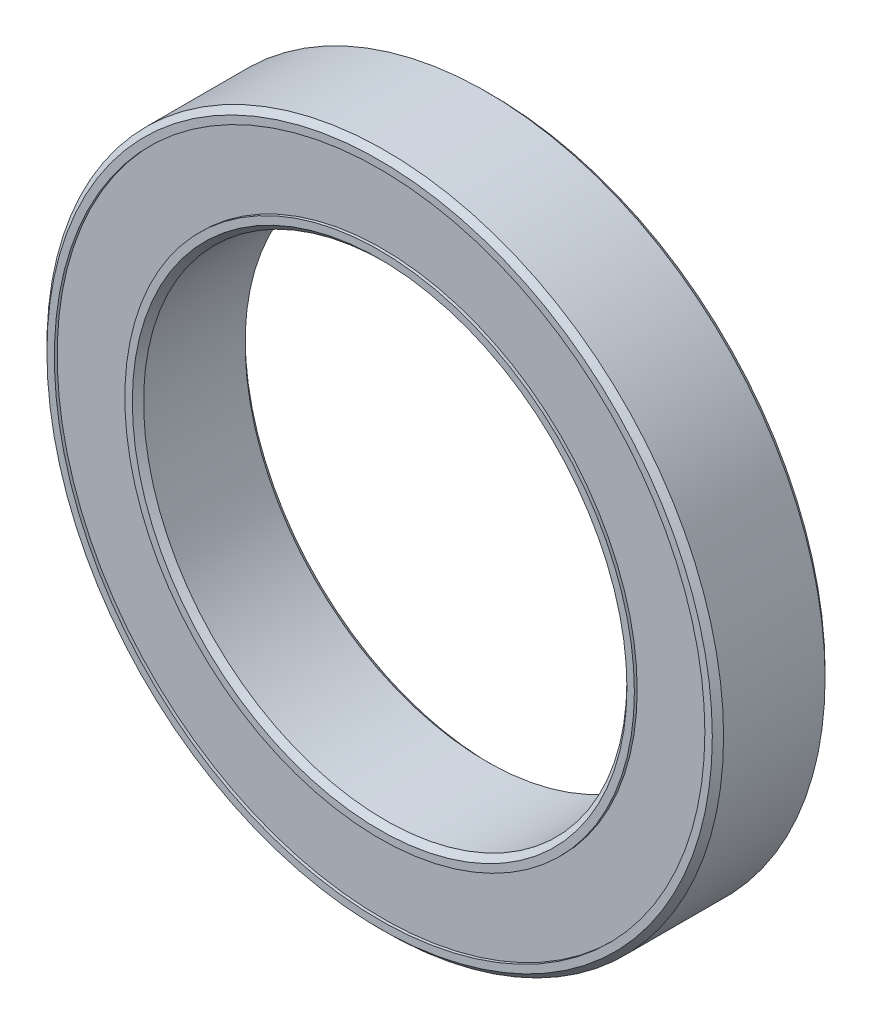
ISO-10303-21;
HEADER;
FILE_DESCRIPTION(('STEP AP214'),'2;1');
FILE_NAME('part.step','',(''),(''),'','','');
FILE_SCHEMA(('AUTOMOTIVE_DESIGN { 1 0 10303 214 1 1 1 1 }'));
ENDSEC;
DATA;
#1=APPLICATION_CONTEXT('core data for automotive mechanical design processes');
#2=APPLICATION_PROTOCOL_DEFINITION('international standard','automotive_design',2000,#1);
#3=PRODUCT_CONTEXT('',#1,'mechanical');
#4=PRODUCT('Part','Part','',(#3));
#5=PRODUCT_RELATED_PRODUCT_CATEGORY('part','',(#4));
#6=PRODUCT_DEFINITION_FORMATION('','',#4);
#7=PRODUCT_DEFINITION_CONTEXT('part definition',#1,'design');
#8=PRODUCT_DEFINITION('design','',#6,#7);
#9=PRODUCT_DEFINITION_SHAPE('','',#8);
#10=(LENGTH_UNIT() NAMED_UNIT(*) SI_UNIT(.MILLI.,.METRE.));
#11=(NAMED_UNIT(*) PLANE_ANGLE_UNIT() SI_UNIT($,.RADIAN.));
#12=(NAMED_UNIT(*) SI_UNIT($,.STERADIAN.) SOLID_ANGLE_UNIT());
#13=UNCERTAINTY_MEASURE_WITH_UNIT(LENGTH_MEASURE(1.E-05),#10,'distance_accuracy_value','');
#14=(GEOMETRIC_REPRESENTATION_CONTEXT(3) GLOBAL_UNCERTAINTY_ASSIGNED_CONTEXT((#13)) GLOBAL_UNIT_ASSIGNED_CONTEXT((#10,
#11,#12)) REPRESENTATION_CONTEXT('',''));
#15=CARTESIAN_POINT('',(0.,0.,0.));
#16=DIRECTION('',(0.,0.,1.));
#17=DIRECTION('',(1.,0.,0.));
#18=AXIS2_PLACEMENT_3D('',#15,#16,#17);
#19=CARTESIAN_POINT('',(0.,20.18725,-3.325));
#20=DIRECTION('',(0.,0.,1.));
#21=DIRECTION('',(1.,0.,0.));
#22=AXIS2_PLACEMENT_3D('',#19,#20,#21);
#23=PLANE('',#22);
#24=CARTESIAN_POINT('',(0.,0.,-3.325));
#25=DIRECTION('',(0.,0.,1.));
#26=DIRECTION('',(1.,0.,0.));
#27=AXIS2_PLACEMENT_3D('',#24,#25,#26);
#28=CIRCLE('',#27,20.18725);
#29=CARTESIAN_POINT('',(20.18725,0.,-3.325));
#30=VERTEX_POINT('',#29);
#31=EDGE_CURVE('E60',#30,#30,#28,.T.);
#32=ORIENTED_EDGE('',*,*,#31,.F.);
#33=EDGE_LOOP('',(#32));
#34=FACE_BOUND('',#33,.T.);
#35=CARTESIAN_POINT('',(0.,0.,-3.325));
#36=DIRECTION('',(0.,0.,1.));
#37=DIRECTION('',(1.,0.,0.));
#38=AXIS2_PLACEMENT_3D('',#35,#36,#37);
#39=CIRCLE('',#38,15.81225);
#40=CARTESIAN_POINT('',(15.81225,0.,-3.325));
#41=VERTEX_POINT('',#40);
#42=EDGE_CURVE('E11',#41,#41,#39,.T.);
#43=ORIENTED_EDGE('',*,*,#42,.T.);
#44=EDGE_LOOP('',(#43));
#45=FACE_BOUND('',#44,.T.);
#46=ADVANCED_FACE('F46',(#34,#45),#23,.F.);
#47=CARTESIAN_POINT('',(0.,0.,3.5));
#48=DIRECTION('',(0.,0.,1.));
#49=DIRECTION('',(1.,0.,0.));
#50=AXIS2_PLACEMENT_3D('',#47,#48,#49);
#51=CYLINDRICAL_SURFACE('',#50,15.81225);
#52=ORIENTED_EDGE('',*,*,#42,.F.);
#53=EDGE_LOOP('',(#52));
#54=FACE_BOUND('',#53,.T.);
#55=CARTESIAN_POINT('',(0.,0.,-2.68419621794304));
#56=DIRECTION('',(0.,0.,1.));
#57=DIRECTION('',(1.,0.,0.));
#58=AXIS2_PLACEMENT_3D('',#55,#56,#57);
#59=CIRCLE('',#58,15.81225);
#60=CARTESIAN_POINT('',(15.81225,0.,-2.68419621794304));
#61=VERTEX_POINT('',#60);
#62=EDGE_CURVE('E52',#61,#61,#59,.T.);
#63=ORIENTED_EDGE('',*,*,#62,.T.);
#64=EDGE_LOOP('',(#63));
#65=FACE_BOUND('',#64,.T.);
#66=ADVANCED_FACE('F69',(#54,#65),#51,.F.);
#67=CARTESIAN_POINT('',(0.,20.18725,-2.68419621794304));
#68=DIRECTION('',(0.,0.,-1.));
#69=DIRECTION('',(-1.,0.,0.));
#70=AXIS2_PLACEMENT_3D('',#67,#68,#69);
#71=PLANE('',#70);
#72=ORIENTED_EDGE('',*,*,#62,.F.);
#73=EDGE_LOOP('',(#72));
#74=FACE_BOUND('',#73,.T.);
#75=CARTESIAN_POINT('',(0.,0.,-2.68419621794304));
#76=DIRECTION('',(0.,0.,1.));
#77=DIRECTION('',(1.,0.,0.));
#78=AXIS2_PLACEMENT_3D('',#75,#76,#77);
#79=CIRCLE('',#78,20.18725);
#80=CARTESIAN_POINT('',(20.18725,0.,-2.68419621794304));
#81=VERTEX_POINT('',#80);
#82=EDGE_CURVE('E56',#81,#81,#79,.T.);
#83=ORIENTED_EDGE('',*,*,#82,.T.);
#84=EDGE_LOOP('',(#83));
#85=FACE_BOUND('',#84,.T.);
#86=ADVANCED_FACE('F73',(#74,#85),#71,.F.);
#87=CARTESIAN_POINT('',(0.,0.,3.5));
#88=DIRECTION('',(0.,0.,1.));
#89=DIRECTION('',(1.,0.,0.));
#90=AXIS2_PLACEMENT_3D('',#87,#88,#89);
#91=CYLINDRICAL_SURFACE('',#90,20.18725);
#92=ORIENTED_EDGE('',*,*,#82,.F.);
#93=EDGE_LOOP('',(#92));
#94=FACE_BOUND('',#93,.T.);
#95=ORIENTED_EDGE('',*,*,#31,.T.);
#96=EDGE_LOOP('',(#95));
#97=FACE_BOUND('',#96,.T.);
#98=ADVANCED_FACE('F66',(#94,#97),#91,.T.);
#99=CLOSED_SHELL('',(#46,#66,#86,#98));
#100=MANIFOLD_SOLID_BREP('B2',#99);
#101=CARTESIAN_POINT('',(0.,20.18725,3.325));
#102=DIRECTION('',(0.,0.,-1.));
#103=DIRECTION('',(-1.,0.,0.));
#104=AXIS2_PLACEMENT_3D('',#101,#102,#103);
#105=PLANE('',#104);
#106=CARTESIAN_POINT('',(0.,0.,3.325));
#107=DIRECTION('',(0.,0.,1.));
#108=DIRECTION('',(1.,0.,0.));
#109=AXIS2_PLACEMENT_3D('',#106,#107,#108);
#110=CIRCLE('',#109,15.81225);
#111=CARTESIAN_POINT('',(15.81225,0.,3.325));
#112=VERTEX_POINT('',#111);
#113=EDGE_CURVE('E45',#112,#112,#110,.T.);
#114=ORIENTED_EDGE('',*,*,#113,.F.);
#115=EDGE_LOOP('',(#114));
#116=FACE_BOUND('',#115,.T.);
#117=CARTESIAN_POINT('',(0.,0.,3.325));
#118=DIRECTION('',(0.,0.,1.));
#119=DIRECTION('',(1.,0.,0.));
#120=AXIS2_PLACEMENT_3D('',#117,#118,#119);
#121=CIRCLE('',#120,20.18725);
#122=CARTESIAN_POINT('',(20.18725,0.,3.325));
#123=VERTEX_POINT('',#122);
#124=EDGE_CURVE('E120',#123,#123,#121,.T.);
#125=ORIENTED_EDGE('',*,*,#124,.T.);
#126=EDGE_LOOP('',(#125));
#127=FACE_BOUND('',#126,.T.);
#128=ADVANCED_FACE('F106',(#116,#127),#105,.F.);
#129=CARTESIAN_POINT('',(0.,0.,3.5));
#130=DIRECTION('',(0.,0.,1.));
#131=DIRECTION('',(1.,0.,0.));
#132=AXIS2_PLACEMENT_3D('',#129,#130,#131);
#133=CYLINDRICAL_SURFACE('',#132,15.81225);
#134=CARTESIAN_POINT('',(0.,0.,2.68419621794304));
#135=DIRECTION('',(0.,0.,1.));
#136=DIRECTION('',(1.,0.,0.));
#137=AXIS2_PLACEMENT_3D('',#134,#135,#136);
#138=CIRCLE('',#137,15.81225);
#139=CARTESIAN_POINT('',(15.81225,0.,2.68419621794304));
#140=VERTEX_POINT('',#139);
#141=EDGE_CURVE('E112',#140,#140,#138,.T.);
#142=ORIENTED_EDGE('',*,*,#141,.F.);
#143=EDGE_LOOP('',(#142));
#144=FACE_BOUND('',#143,.T.);
#145=ORIENTED_EDGE('',*,*,#113,.T.);
#146=EDGE_LOOP('',(#145));
#147=FACE_BOUND('',#146,.T.);
#148=ADVANCED_FACE('F135',(#144,#147),#133,.F.);
#149=CARTESIAN_POINT('',(0.,20.18725,2.68419621794304));
#150=DIRECTION('',(0.,0.,1.));
#151=DIRECTION('',(1.,0.,0.));
#152=AXIS2_PLACEMENT_3D('',#149,#150,#151);
#153=PLANE('',#152);
#154=CARTESIAN_POINT('',(0.,0.,2.68419621794304));
#155=DIRECTION('',(0.,0.,1.));
#156=DIRECTION('',(1.,0.,0.));
#157=AXIS2_PLACEMENT_3D('',#154,#155,#156);
#158=CIRCLE('',#157,20.18725);
#159=CARTESIAN_POINT('',(20.18725,0.,2.68419621794304));
#160=VERTEX_POINT('',#159);
#161=EDGE_CURVE('E116',#160,#160,#158,.T.);
#162=ORIENTED_EDGE('',*,*,#161,.F.);
#163=EDGE_LOOP('',(#162));
#164=FACE_BOUND('',#163,.T.);
#165=ORIENTED_EDGE('',*,*,#141,.T.);
#166=EDGE_LOOP('',(#165));
#167=FACE_BOUND('',#166,.T.);
#168=ADVANCED_FACE('F130',(#164,#167),#153,.F.);
#169=CARTESIAN_POINT('',(0.,0.,3.5));
#170=DIRECTION('',(0.,0.,1.));
#171=DIRECTION('',(1.,0.,0.));
#172=AXIS2_PLACEMENT_3D('',#169,#170,#171);
#173=CYLINDRICAL_SURFACE('',#172,20.18725);
#174=ORIENTED_EDGE('',*,*,#124,.F.);
#175=EDGE_LOOP('',(#174));
#176=FACE_BOUND('',#175,.T.);
#177=ORIENTED_EDGE('',*,*,#161,.T.);
#178=EDGE_LOOP('',(#177));
#179=FACE_BOUND('',#178,.T.);
#180=ADVANCED_FACE('F127',(#176,#179),#173,.T.);
#181=CLOSED_SHELL('',(#128,#148,#168,#180));
#182=MANIFOLD_SOLID_BREP('B6',#181);
#183=CARTESIAN_POINT('',(-8.9998749999998,15.5882407617691,0.));
#184=DIRECTION('',(0.,0.,1.));
#185=DIRECTION('',(-0.499999999999989,0.866025403784445,0.));
#186=AXIS2_PLACEMENT_3D('',#183,#184,#185);
#187=SPHERICAL_SURFACE('',#186,2.68419621794304);
#188=CARTESIAN_POINT('',(-8.9998749999998,15.5882407617691,2.68419621794304));
#189=VERTEX_POINT('',#188);
#190=VERTEX_LOOP('',#189);
#191=FACE_BOUND('',#190,.T.);
#192=ADVANCED_FACE('F166',(#191),#187,.T.);
#193=CLOSED_SHELL('',(#192));
#194=MANIFOLD_SOLID_BREP('B40',#193);
#195=CARTESIAN_POINT('',(-15.5882407617688,8.99987500000018,0.));
#196=DIRECTION('',(0.,0.,1.));
#197=DIRECTION('',(-0.866025403784433,0.50000000000001,0.));
#198=AXIS2_PLACEMENT_3D('',#195,#196,#197);
#199=SPHERICAL_SURFACE('',#198,2.68419621794304);
#200=CARTESIAN_POINT('',(-15.5882407617688,8.99987500000018,2.68419621794304));
#201=VERTEX_POINT('',#200);
#202=VERTEX_LOOP('',#201);
#203=FACE_BOUND('',#202,.T.);
#204=ADVANCED_FACE('F185',(#203),#199,.T.);
#205=CLOSED_SHELL('',(#204));
#206=MANIFOLD_SOLID_BREP('B102',#205);
#207=CARTESIAN_POINT('',(-17.99975,1.88537373686525E-13,0.));
#208=DIRECTION('',(0.,0.,1.));
#209=DIRECTION('',(-1.,0.,0.));
#210=AXIS2_PLACEMENT_3D('',#207,#208,#209);
#211=SPHERICAL_SURFACE('',#210,2.68419621794304);
#212=CARTESIAN_POINT('',(-17.99975,1.88537373686525E-13,2.68419621794304));
#213=VERTEX_POINT('',#212);
#214=VERTEX_LOOP('',#213);
#215=FACE_BOUND('',#214,.T.);
#216=ADVANCED_FACE('F204',(#215),#211,.T.);
#217=CLOSED_SHELL('',(#216));
#218=MANIFOLD_SOLID_BREP('B162',#217);
#219=CARTESIAN_POINT('',(-15.588240761769,-8.99987499999986,0.));
#220=DIRECTION('',(0.,0.,1.));
#221=DIRECTION('',(-0.866025403784443,-0.499999999999992,0.));
#222=AXIS2_PLACEMENT_3D('',#219,#220,#221);
#223=SPHERICAL_SURFACE('',#222,2.68419621794304);
#224=CARTESIAN_POINT('',(-15.588240761769,-8.99987499999986,2.68419621794304));
#225=VERTEX_POINT('',#224);
#226=VERTEX_LOOP('',#225);
#227=FACE_BOUND('',#226,.T.);
#228=ADVANCED_FACE('F223',(#227),#223,.T.);
#229=CLOSED_SHELL('',(#228));
#230=MANIFOLD_SOLID_BREP('B181',#229);
#231=CARTESIAN_POINT('',(-8.99987500000013,-15.5882407617689,0.));
#232=DIRECTION('',(0.,0.,1.));
#233=DIRECTION('',(-0.500000000000007,-0.866025403784435,0.));
#234=AXIS2_PLACEMENT_3D('',#231,#232,#233);
#235=SPHERICAL_SURFACE('',#234,2.68419621794304);
#236=CARTESIAN_POINT('',(-8.99987500000013,-15.5882407617689,2.68419621794304));
#237=VERTEX_POINT('',#236);
#238=VERTEX_LOOP('',#237);
#239=FACE_BOUND('',#238,.T.);
#240=ADVANCED_FACE('F242',(#239),#235,.T.);
#241=CLOSED_SHELL('',(#240));
#242=MANIFOLD_SOLID_BREP('B200',#241);
#243=CARTESIAN_POINT('',(-1.25691582457683E-13,-17.99975,0.));
#244=DIRECTION('',(0.,0.,1.));
#245=DIRECTION('',(0.,-1.,0.));
#246=AXIS2_PLACEMENT_3D('',#243,#244,#245);
#247=SPHERICAL_SURFACE('',#246,2.68419621794304);
#248=CARTESIAN_POINT('',(-1.25691582457683E-13,-17.99975,2.68419621794304));
#249=VERTEX_POINT('',#248);
#250=VERTEX_LOOP('',#249);
#251=FACE_BOUND('',#250,.T.);
#252=ADVANCED_FACE('F261',(#251),#247,.T.);
#253=CLOSED_SHELL('',(#252));
#254=MANIFOLD_SOLID_BREP('B219',#253);
#255=CARTESIAN_POINT('',(8.99987499999991,-15.588240761769,0.));
#256=DIRECTION('',(0.,0.,1.));
#257=DIRECTION('',(0.499999999999995,-0.866025403784442,0.));
#258=AXIS2_PLACEMENT_3D('',#255,#256,#257);
#259=SPHERICAL_SURFACE('',#258,2.68419621794304);
#260=CARTESIAN_POINT('',(8.99987499999991,-15.588240761769,2.68419621794304));
#261=VERTEX_POINT('',#260);
#262=VERTEX_LOOP('',#261);
#263=FACE_BOUND('',#262,.T.);
#264=ADVANCED_FACE('F280',(#263),#259,.T.);
#265=CLOSED_SHELL('',(#264));
#266=MANIFOLD_SOLID_BREP('B238',#265);
#267=CARTESIAN_POINT('',(15.5882407617689,-8.99987500000008,0.));
#268=DIRECTION('',(0.,0.,1.));
#269=DIRECTION('',(0.866025403784436,-0.500000000000004,0.));
#270=AXIS2_PLACEMENT_3D('',#267,#268,#269);
#271=SPHERICAL_SURFACE('',#270,2.68419621794304);
#272=CARTESIAN_POINT('',(15.5882407617689,-8.99987500000008,2.68419621794304));
#273=VERTEX_POINT('',#272);
#274=VERTEX_LOOP('',#273);
#275=FACE_BOUND('',#274,.T.);
#276=ADVANCED_FACE('F299',(#275),#271,.T.);
#277=CLOSED_SHELL('',(#276));
#278=MANIFOLD_SOLID_BREP('B257',#277);
#279=CARTESIAN_POINT('',(17.99975,0.,0.));
#280=DIRECTION('',(0.,0.,1.));
#281=DIRECTION('',(1.,0.,0.));
#282=AXIS2_PLACEMENT_3D('',#279,#280,#281);
#283=SPHERICAL_SURFACE('',#282,2.68419621794304);
#284=CARTESIAN_POINT('',(17.99975,0.,2.68419621794304));
#285=VERTEX_POINT('',#284);
#286=VERTEX_LOOP('',#285);
#287=FACE_BOUND('',#286,.T.);
#288=ADVANCED_FACE('F318',(#287),#283,.T.);
#289=CLOSED_SHELL('',(#288));
#290=MANIFOLD_SOLID_BREP('B276',#289);
#291=CARTESIAN_POINT('',(15.588240761769,8.99987499999996,0.));
#292=DIRECTION('',(0.,0.,1.));
#293=DIRECTION('',(0.86602540378444,0.499999999999998,0.));
#294=AXIS2_PLACEMENT_3D('',#291,#292,#293);
#295=SPHERICAL_SURFACE('',#294,2.68419621794304);
#296=CARTESIAN_POINT('',(15.588240761769,8.99987499999996,2.68419621794304));
#297=VERTEX_POINT('',#296);
#298=VERTEX_LOOP('',#297);
#299=FACE_BOUND('',#298,.T.);
#300=ADVANCED_FACE('F337',(#299),#295,.T.);
#301=CLOSED_SHELL('',(#300));
#302=MANIFOLD_SOLID_BREP('B295',#301);
#303=CARTESIAN_POINT('',(8.99987500000002,15.5882407617689,0.));
#304=DIRECTION('',(0.,0.,1.));
#305=DIRECTION('',(0.500000000000001,0.866025403784438,0.));
#306=AXIS2_PLACEMENT_3D('',#303,#304,#305);
#307=SPHERICAL_SURFACE('',#306,2.68419621794304);
#308=CARTESIAN_POINT('',(8.99987500000002,15.5882407617689,2.68419621794304));
#309=VERTEX_POINT('',#308);
#310=VERTEX_LOOP('',#309);
#311=FACE_BOUND('',#310,.T.);
#312=ADVANCED_FACE('F356',(#311),#307,.T.);
#313=CLOSED_SHELL('',(#312));
#314=MANIFOLD_SOLID_BREP('B314',#313);
#315=CARTESIAN_POINT('',(0.,17.99975,0.));
#316=DIRECTION('',(0.,0.,1.));
#317=DIRECTION('',(0.,1.,0.));
#318=AXIS2_PLACEMENT_3D('',#315,#316,#317);
#319=SPHERICAL_SURFACE('',#318,2.68419621794304);
#320=CARTESIAN_POINT('',(0.,17.99975,2.68419621794304));
#321=VERTEX_POINT('',#320);
#322=VERTEX_LOOP('',#321);
#323=FACE_BOUND('',#322,.T.);
#324=ADVANCED_FACE('F377',(#323),#319,.T.);
#325=CLOSED_SHELL('',(#324));
#326=MANIFOLD_SOLID_BREP('B333',#325);
#327=CARTESIAN_POINT('',(0.,0.,3.5));
#328=DIRECTION('',(0.,0.,1.));
#329=DIRECTION('',(1.,0.,0.));
#330=AXIS2_PLACEMENT_3D('',#327,#328,#329);
#331=CONICAL_SURFACE('',#330,15.3495,0.78539816339745);
#332=CARTESIAN_POINT('',(0.,0.,3.15));
#333=DIRECTION('',(0.,0.,1.));
#334=DIRECTION('',(1.,0.,0.));
#335=AXIS2_PLACEMENT_3D('',#332,#333,#334);
#336=CIRCLE('',#335,14.9995);
#337=CARTESIAN_POINT('',(14.9995,0.,3.15));
#338=VERTEX_POINT('',#337);
#339=EDGE_CURVE('E376',#338,#338,#336,.T.);
#340=ORIENTED_EDGE('',*,*,#339,.F.);
#341=EDGE_LOOP('',(#340));
#342=FACE_BOUND('',#341,.T.);
#343=CARTESIAN_POINT('',(0.,0.,3.5));
#344=DIRECTION('',(0.,0.,1.));
#345=DIRECTION('',(1.,0.,0.));
#346=AXIS2_PLACEMENT_3D('',#343,#344,#345);
#347=CIRCLE('',#346,15.3495);
#348=CARTESIAN_POINT('',(15.3495,0.,3.5));
#349=VERTEX_POINT('',#348);
#350=EDGE_CURVE('E423',#349,#349,#347,.T.);
#351=ORIENTED_EDGE('',*,*,#350,.T.);
#352=EDGE_LOOP('',(#351));
#353=FACE_BOUND('',#352,.T.);
#354=ADVANCED_FACE('F395',(#342,#353),#331,.F.);
#355=CARTESIAN_POINT('',(0.,0.,3.5));
#356=DIRECTION('',(0.,0.,1.));
#357=DIRECTION('',(1.,0.,0.));
#358=AXIS2_PLACEMENT_3D('',#355,#356,#357);
#359=CYLINDRICAL_SURFACE('',#358,14.9995);
#360=CARTESIAN_POINT('',(0.,0.,-3.15));
#361=DIRECTION('',(0.,0.,1.));
#362=DIRECTION('',(1.,0.,0.));
#363=AXIS2_PLACEMENT_3D('',#360,#361,#362);
#364=CIRCLE('',#363,14.9995);
#365=CARTESIAN_POINT('',(14.9995,0.,-3.15));
#366=VERTEX_POINT('',#365);
#367=EDGE_CURVE('E401',#366,#366,#364,.T.);
#368=ORIENTED_EDGE('',*,*,#367,.F.);
#369=EDGE_LOOP('',(#368));
#370=FACE_BOUND('',#369,.T.);
#371=ORIENTED_EDGE('',*,*,#339,.T.);
#372=EDGE_LOOP('',(#371));
#373=FACE_BOUND('',#372,.T.);
#374=ADVANCED_FACE('F460',(#370,#373),#359,.F.);
#375=CARTESIAN_POINT('',(0.,0.,-3.15));
#376=DIRECTION('',(0.,0.,-1.));
#377=DIRECTION('',(-1.,0.,0.));
#378=AXIS2_PLACEMENT_3D('',#375,#376,#377);
#379=CONICAL_SURFACE('',#378,14.9995,0.785398163397451);
#380=CARTESIAN_POINT('',(0.,0.,-3.5));
#381=DIRECTION('',(0.,0.,1.));
#382=DIRECTION('',(1.,0.,0.));
#383=AXIS2_PLACEMENT_3D('',#380,#381,#382);
#384=CIRCLE('',#383,15.3495);
#385=CARTESIAN_POINT('',(15.3495,0.,-3.5));
#386=VERTEX_POINT('',#385);
#387=EDGE_CURVE('E405',#386,#386,#384,.T.);
#388=ORIENTED_EDGE('',*,*,#387,.F.);
#389=EDGE_LOOP('',(#388));
#390=FACE_BOUND('',#389,.T.);
#391=ORIENTED_EDGE('',*,*,#367,.T.);
#392=EDGE_LOOP('',(#391));
#393=FACE_BOUND('',#392,.T.);
#394=ADVANCED_FACE('F455',(#390,#393),#379,.F.);
#395=CARTESIAN_POINT('',(0.,15.3495,-3.5));
#396=DIRECTION('',(0.,0.,1.));
#397=DIRECTION('',(1.,0.,0.));
#398=AXIS2_PLACEMENT_3D('',#395,#396,#397);
#399=PLANE('',#398);
#400=CARTESIAN_POINT('',(0.,0.,-3.5));
#401=DIRECTION('',(0.,0.,1.));
#402=DIRECTION('',(1.,0.,0.));
#403=AXIS2_PLACEMENT_3D('',#400,#401,#402);
#404=CIRCLE('',#403,15.81225);
#405=CARTESIAN_POINT('',(15.81225,0.,-3.5));
#406=VERTEX_POINT('',#405);
#407=EDGE_CURVE('E409',#406,#406,#404,.T.);
#408=ORIENTED_EDGE('',*,*,#407,.F.);
#409=EDGE_LOOP('',(#408));
#410=FACE_BOUND('',#409,.T.);
#411=ORIENTED_EDGE('',*,*,#387,.T.);
#412=EDGE_LOOP('',(#411));
#413=FACE_BOUND('',#412,.T.);
#414=ADVANCED_FACE('F449',(#410,#413),#399,.F.);
#415=CARTESIAN_POINT('',(0.,0.,3.5));
#416=DIRECTION('',(0.,0.,1.));
#417=DIRECTION('',(1.,0.,0.));
#418=AXIS2_PLACEMENT_3D('',#415,#416,#417);
#419=CYLINDRICAL_SURFACE('',#418,15.81225);
#420=CARTESIAN_POINT('',(0.,0.,-1.55555555555555));
#421=DIRECTION('',(0.,0.,1.));
#422=DIRECTION('',(1.,0.,0.));
#423=AXIS2_PLACEMENT_3D('',#420,#421,#422);
#424=CIRCLE('',#423,15.81225);
#425=CARTESIAN_POINT('',(15.81225,0.,-1.55555555555555));
#426=VERTEX_POINT('',#425);
#427=EDGE_CURVE('E414',#426,#426,#424,.T.);
#428=ORIENTED_EDGE('',*,*,#427,.F.);
#429=EDGE_LOOP('',(#428));
#430=FACE_BOUND('',#429,.T.);
#431=ORIENTED_EDGE('',*,*,#407,.T.);
#432=EDGE_LOOP('',(#431));
#433=FACE_BOUND('',#432,.T.);
#434=ADVANCED_FACE('F443',(#430,#433),#419,.T.);
#435=CARTESIAN_POINT('',(0.,0.,0.));
#436=DIRECTION('',(0.,0.,1.));
#437=DIRECTION('',(1.,0.,0.));
#438=AXIS2_PLACEMENT_3D('',#435,#436,#437);
#439=TOROIDAL_SURFACE('',#438,17.99975,2.68419621794304);
#440=CARTESIAN_POINT('',(0.,0.,1.55555555555556));
#441=DIRECTION('',(0.,0.,1.));
#442=DIRECTION('',(1.,0.,0.));
#443=AXIS2_PLACEMENT_3D('',#440,#441,#442);
#444=CIRCLE('',#443,15.81225);
#445=CARTESIAN_POINT('',(15.81225,0.,1.55555555555556));
#446=VERTEX_POINT('',#445);
#447=EDGE_CURVE('E417',#446,#446,#444,.T.);
#448=ORIENTED_EDGE('',*,*,#447,.F.);
#449=EDGE_LOOP('',(#448));
#450=FACE_BOUND('',#449,.T.);
#451=ORIENTED_EDGE('',*,*,#427,.T.);
#452=EDGE_LOOP('',(#451));
#453=FACE_BOUND('',#452,.T.);
#454=ADVANCED_FACE('F437',(#450,#453),#439,.F.);
#455=CARTESIAN_POINT('',(0.,0.,3.5));
#456=DIRECTION('',(0.,0.,1.));
#457=DIRECTION('',(1.,0.,0.));
#458=AXIS2_PLACEMENT_3D('',#455,#456,#457);
#459=CYLINDRICAL_SURFACE('',#458,15.81225);
#460=CARTESIAN_POINT('',(0.,0.,3.5));
#461=DIRECTION('',(0.,0.,1.));
#462=DIRECTION('',(1.,0.,0.));
#463=AXIS2_PLACEMENT_3D('',#460,#461,#462);
#464=CIRCLE('',#463,15.81225);
#465=CARTESIAN_POINT('',(15.81225,0.,3.5));
#466=VERTEX_POINT('',#465);
#467=EDGE_CURVE('E420',#466,#466,#464,.T.);
#468=ORIENTED_EDGE('',*,*,#467,.F.);
#469=EDGE_LOOP('',(#468));
#470=FACE_BOUND('',#469,.T.);
#471=ORIENTED_EDGE('',*,*,#447,.T.);
#472=EDGE_LOOP('',(#471));
#473=FACE_BOUND('',#472,.T.);
#474=ADVANCED_FACE('F431',(#470,#473),#459,.T.);
#475=CARTESIAN_POINT('',(0.,15.3495,3.5));
#476=DIRECTION('',(0.,0.,-1.));
#477=DIRECTION('',(-1.,0.,0.));
#478=AXIS2_PLACEMENT_3D('',#475,#476,#477);
#479=PLANE('',#478);
#480=ORIENTED_EDGE('',*,*,#350,.F.);
#481=EDGE_LOOP('',(#480));
#482=FACE_BOUND('',#481,.T.);
#483=ORIENTED_EDGE('',*,*,#467,.T.);
#484=EDGE_LOOP('',(#483));
#485=FACE_BOUND('',#484,.T.);
#486=ADVANCED_FACE('F428',(#482,#485),#479,.F.);
#487=CLOSED_SHELL('',(#354,#374,#394,#414,#434,#454,#474,#486));
#488=MANIFOLD_SOLID_BREP('B352',#487);
#489=CARTESIAN_POINT('',(0.,0.,3.15));
#490=DIRECTION('',(0.,0.,-1.));
#491=DIRECTION('',(-1.,0.,0.));
#492=AXIS2_PLACEMENT_3D('',#489,#490,#491);
#493=CONICAL_SURFACE('',#492,21.,0.785398163397448);
#494=CARTESIAN_POINT('',(0.,0.,3.5));
#495=DIRECTION('',(0.,0.,1.));
#496=DIRECTION('',(1.,0.,0.));
#497=AXIS2_PLACEMENT_3D('',#494,#495,#496);
#498=CIRCLE('',#497,20.65);
#499=CARTESIAN_POINT('',(20.65,0.,3.5));
#500=VERTEX_POINT('',#499);
#501=EDGE_CURVE('E394',#500,#500,#498,.T.);
#502=ORIENTED_EDGE('',*,*,#501,.F.);
#503=EDGE_LOOP('',(#502));
#504=FACE_BOUND('',#503,.T.);
#505=CARTESIAN_POINT('',(0.,0.,3.15));
#506=DIRECTION('',(0.,0.,1.));
#507=DIRECTION('',(1.,0.,0.));
#508=AXIS2_PLACEMENT_3D('',#505,#506,#507);
#509=CIRCLE('',#508,21.);
#510=CARTESIAN_POINT('',(21.,0.,3.15));
#511=VERTEX_POINT('',#510);
#512=EDGE_CURVE('E529',#511,#511,#509,.T.);
#513=ORIENTED_EDGE('',*,*,#512,.T.);
#514=EDGE_LOOP('',(#513));
#515=FACE_BOUND('',#514,.T.);
#516=ADVANCED_FACE('F501',(#504,#515),#493,.T.);
#517=CARTESIAN_POINT('',(0.,20.65,3.5));
#518=DIRECTION('',(0.,0.,-1.));
#519=DIRECTION('',(-1.,0.,0.));
#520=AXIS2_PLACEMENT_3D('',#517,#518,#519);
#521=PLANE('',#520);
#522=CARTESIAN_POINT('',(0.,0.,3.5));
#523=DIRECTION('',(0.,0.,1.));
#524=DIRECTION('',(1.,0.,0.));
#525=AXIS2_PLACEMENT_3D('',#522,#523,#524);
#526=CIRCLE('',#525,20.18725);
#527=CARTESIAN_POINT('',(20.18725,0.,3.5));
#528=VERTEX_POINT('',#527);
#529=EDGE_CURVE('E507',#528,#528,#526,.T.);
#530=ORIENTED_EDGE('',*,*,#529,.F.);
#531=EDGE_LOOP('',(#530));
#532=FACE_BOUND('',#531,.T.);
#533=ORIENTED_EDGE('',*,*,#501,.T.);
#534=EDGE_LOOP('',(#533));
#535=FACE_BOUND('',#534,.T.);
#536=ADVANCED_FACE('F566',(#532,#535),#521,.F.);
#537=CARTESIAN_POINT('',(0.,0.,3.5));
#538=DIRECTION('',(0.,0.,1.));
#539=DIRECTION('',(1.,0.,0.));
#540=AXIS2_PLACEMENT_3D('',#537,#538,#539);
#541=CYLINDRICAL_SURFACE('',#540,20.18725);
#542=CARTESIAN_POINT('',(0.,0.,1.55555555555556));
#543=DIRECTION('',(0.,0.,1.));
#544=DIRECTION('',(1.,0.,0.));
#545=AXIS2_PLACEMENT_3D('',#542,#543,#544);
#546=CIRCLE('',#545,20.18725);
#547=CARTESIAN_POINT('',(20.18725,0.,1.55555555555556));
#548=VERTEX_POINT('',#547);
#549=EDGE_CURVE('E511',#548,#548,#546,.T.);
#550=ORIENTED_EDGE('',*,*,#549,.F.);
#551=EDGE_LOOP('',(#550));
#552=FACE_BOUND('',#551,.T.);
#553=ORIENTED_EDGE('',*,*,#529,.T.);
#554=EDGE_LOOP('',(#553));
#555=FACE_BOUND('',#554,.T.);
#556=ADVANCED_FACE('F561',(#552,#555),#541,.F.);
#557=CARTESIAN_POINT('',(0.,0.,0.));
#558=DIRECTION('',(0.,0.,1.));
#559=DIRECTION('',(1.,0.,0.));
#560=AXIS2_PLACEMENT_3D('',#557,#558,#559);
#561=TOROIDAL_SURFACE('',#560,17.99975,2.68419621794304);
#562=CARTESIAN_POINT('',(0.,0.,-1.55555555555556));
#563=DIRECTION('',(0.,0.,1.));
#564=DIRECTION('',(1.,0.,0.));
#565=AXIS2_PLACEMENT_3D('',#562,#563,#564);
#566=CIRCLE('',#565,20.18725);
#567=CARTESIAN_POINT('',(20.18725,0.,-1.55555555555556));
#568=VERTEX_POINT('',#567);
#569=EDGE_CURVE('E515',#568,#568,#566,.T.);
#570=ORIENTED_EDGE('',*,*,#569,.F.);
#571=EDGE_LOOP('',(#570));
#572=FACE_BOUND('',#571,.T.);
#573=ORIENTED_EDGE('',*,*,#549,.T.);
#574=EDGE_LOOP('',(#573));
#575=FACE_BOUND('',#574,.T.);
#576=ADVANCED_FACE('F555',(#572,#575),#561,.F.);
#577=CARTESIAN_POINT('',(0.,0.,3.5));
#578=DIRECTION('',(0.,0.,1.));
#579=DIRECTION('',(1.,0.,0.));
#580=AXIS2_PLACEMENT_3D('',#577,#578,#579);
#581=CYLINDRICAL_SURFACE('',#580,20.18725);
#582=CARTESIAN_POINT('',(0.,0.,-3.5));
#583=DIRECTION('',(0.,0.,1.));
#584=DIRECTION('',(1.,0.,0.));
#585=AXIS2_PLACEMENT_3D('',#582,#583,#584);
#586=CIRCLE('',#585,20.18725);
#587=CARTESIAN_POINT('',(20.18725,0.,-3.5));
#588=VERTEX_POINT('',#587);
#589=EDGE_CURVE('E520',#588,#588,#586,.T.);
#590=ORIENTED_EDGE('',*,*,#589,.F.);
#591=EDGE_LOOP('',(#590));
#592=FACE_BOUND('',#591,.T.);
#593=ORIENTED_EDGE('',*,*,#569,.T.);
#594=EDGE_LOOP('',(#593));
#595=FACE_BOUND('',#594,.T.);
#596=ADVANCED_FACE('F549',(#592,#595),#581,.F.);
#597=CARTESIAN_POINT('',(0.,20.65,-3.5));
#598=DIRECTION('',(0.,0.,1.));
#599=DIRECTION('',(1.,0.,0.));
#600=AXIS2_PLACEMENT_3D('',#597,#598,#599);
#601=PLANE('',#600);
#602=CARTESIAN_POINT('',(0.,0.,-3.5));
#603=DIRECTION('',(0.,0.,1.));
#604=DIRECTION('',(1.,0.,0.));
#605=AXIS2_PLACEMENT_3D('',#602,#603,#604);
#606=CIRCLE('',#605,20.65);
#607=CARTESIAN_POINT('',(20.65,0.,-3.5));
#608=VERTEX_POINT('',#607);
#609=EDGE_CURVE('E523',#608,#608,#606,.T.);
#610=ORIENTED_EDGE('',*,*,#609,.F.);
#611=EDGE_LOOP('',(#610));
#612=FACE_BOUND('',#611,.T.);
#613=ORIENTED_EDGE('',*,*,#589,.T.);
#614=EDGE_LOOP('',(#613));
#615=FACE_BOUND('',#614,.T.);
#616=ADVANCED_FACE('F543',(#612,#615),#601,.F.);
#617=CARTESIAN_POINT('',(0.,0.,-3.5));
#618=DIRECTION('',(0.,0.,1.));
#619=DIRECTION('',(1.,0.,0.));
#620=AXIS2_PLACEMENT_3D('',#617,#618,#619);
#621=CONICAL_SURFACE('',#620,20.65,0.785398163397448);
#622=CARTESIAN_POINT('',(0.,0.,-3.15));
#623=DIRECTION('',(0.,0.,1.));
#624=DIRECTION('',(1.,0.,0.));
#625=AXIS2_PLACEMENT_3D('',#622,#623,#624);
#626=CIRCLE('',#625,21.);
#627=CARTESIAN_POINT('',(21.,0.,-3.15));
#628=VERTEX_POINT('',#627);
#629=EDGE_CURVE('E526',#628,#628,#626,.T.);
#630=ORIENTED_EDGE('',*,*,#629,.F.);
#631=EDGE_LOOP('',(#630));
#632=FACE_BOUND('',#631,.T.);
#633=ORIENTED_EDGE('',*,*,#609,.T.);
#634=EDGE_LOOP('',(#633));
#635=FACE_BOUND('',#634,.T.);
#636=ADVANCED_FACE('F537',(#632,#635),#621,.T.);
#637=CARTESIAN_POINT('',(0.,0.,3.5));
#638=DIRECTION('',(0.,0.,1.));
#639=DIRECTION('',(1.,0.,0.));
#640=AXIS2_PLACEMENT_3D('',#637,#638,#639);
#641=CYLINDRICAL_SURFACE('',#640,21.);
#642=ORIENTED_EDGE('',*,*,#512,.F.);
#643=EDGE_LOOP('',(#642));
#644=FACE_BOUND('',#643,.T.);
#645=ORIENTED_EDGE('',*,*,#629,.T.);
#646=EDGE_LOOP('',(#645));
#647=FACE_BOUND('',#646,.T.);
#648=ADVANCED_FACE('F534',(#644,#647),#641,.T.);
#649=CLOSED_SHELL('',(#516,#536,#556,#576,#596,#616,#636,#648));
#650=MANIFOLD_SOLID_BREP('B371',#649);
#651=ADVANCED_BREP_SHAPE_REPRESENTATION('',(#18,#100,#182,#194,#206,#218,#230,#242,#254,#266,
#278,#290,#302,#314,#326,#488,#650),#14);
#652=SHAPE_DEFINITION_REPRESENTATION(#9,#651);
ENDSEC;
END-ISO-10303-21;
